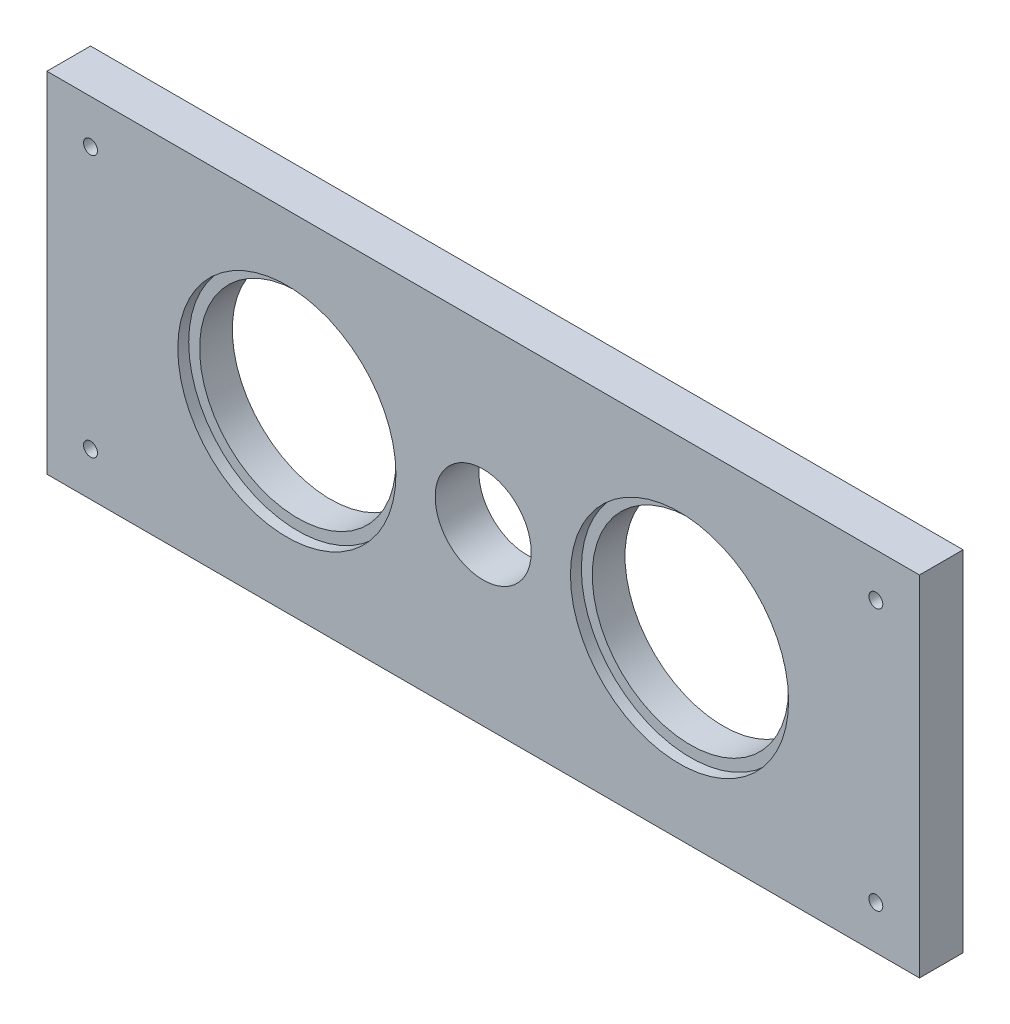
ISO-10303-21;
HEADER;
FILE_DESCRIPTION(('STEP AP214'),'2;1');
FILE_NAME('part.step','',(''),(''),'','','');
FILE_SCHEMA(('AUTOMOTIVE_DESIGN { 1 0 10303 214 1 1 1 1 }'));
ENDSEC;
DATA;
#1=APPLICATION_CONTEXT('core data for automotive mechanical design processes');
#2=APPLICATION_PROTOCOL_DEFINITION('international standard','automotive_design',2000,#1);
#3=PRODUCT_CONTEXT('',#1,'mechanical');
#4=PRODUCT('Part','Part','',(#3));
#5=PRODUCT_RELATED_PRODUCT_CATEGORY('part','',(#4));
#6=PRODUCT_DEFINITION_FORMATION('','',#4);
#7=PRODUCT_DEFINITION_CONTEXT('part definition',#1,'design');
#8=PRODUCT_DEFINITION('design','',#6,#7);
#9=PRODUCT_DEFINITION_SHAPE('','',#8);
#10=(LENGTH_UNIT() NAMED_UNIT(*) SI_UNIT(.MILLI.,.METRE.));
#11=(NAMED_UNIT(*) PLANE_ANGLE_UNIT() SI_UNIT($,.RADIAN.));
#12=(NAMED_UNIT(*) SI_UNIT($,.STERADIAN.) SOLID_ANGLE_UNIT());
#13=UNCERTAINTY_MEASURE_WITH_UNIT(LENGTH_MEASURE(1.E-05),#10,'distance_accuracy_value','');
#14=(GEOMETRIC_REPRESENTATION_CONTEXT(3) GLOBAL_UNCERTAINTY_ASSIGNED_CONTEXT((#13)) GLOBAL_UNIT_ASSIGNED_CONTEXT((#10,
#11,#12)) REPRESENTATION_CONTEXT('',''));
#15=CARTESIAN_POINT('',(0.,0.,0.));
#16=DIRECTION('',(0.,0.,1.));
#17=DIRECTION('',(1.,0.,0.));
#18=AXIS2_PLACEMENT_3D('',#15,#16,#17);
#19=CARTESIAN_POINT('',(57.15,0.,-12.7));
#20=DIRECTION('',(0.,0.,1.));
#21=DIRECTION('',(1.,0.,0.));
#22=AXIS2_PLACEMENT_3D('',#19,#20,#21);
#23=CYLINDRICAL_SURFACE('',#22,28.575);
#24=CARTESIAN_POINT('',(57.15,0.,-12.7));
#25=DIRECTION('',(0.,0.,1.));
#26=DIRECTION('',(1.,0.,0.));
#27=AXIS2_PLACEMENT_3D('',#24,#25,#26);
#28=CIRCLE('',#27,28.575);
#29=CARTESIAN_POINT('',(85.725,0.,-12.7));
#30=VERTEX_POINT('',#29);
#31=EDGE_CURVE('E95',#30,#30,#28,.T.);
#32=ORIENTED_EDGE('',*,*,#31,.F.);
#33=EDGE_LOOP('',(#32));
#34=FACE_BOUND('',#33,.T.);
#35=CARTESIAN_POINT('',(57.15,0.,-3.175));
#36=DIRECTION('',(0.,0.,1.));
#37=DIRECTION('',(1.,0.,0.));
#38=AXIS2_PLACEMENT_3D('',#35,#36,#37);
#39=CIRCLE('',#38,28.575);
#40=CARTESIAN_POINT('',(85.725,0.,-3.175));
#41=VERTEX_POINT('',#40);
#42=EDGE_CURVE('E35',#41,#41,#39,.F.);
#43=ORIENTED_EDGE('',*,*,#42,.F.);
#44=EDGE_LOOP('',(#43));
#45=FACE_BOUND('',#44,.T.);
#46=ADVANCED_FACE('F31',(#34,#45),#23,.F.);
#47=CARTESIAN_POINT('',(-57.15,0.,-12.7));
#48=DIRECTION('',(0.,0.,1.));
#49=DIRECTION('',(1.,0.,0.));
#50=AXIS2_PLACEMENT_3D('',#47,#48,#49);
#51=CYLINDRICAL_SURFACE('',#50,28.575);
#52=CARTESIAN_POINT('',(-57.15,0.,-12.7));
#53=DIRECTION('',(0.,0.,1.));
#54=DIRECTION('',(1.,0.,0.));
#55=AXIS2_PLACEMENT_3D('',#52,#53,#54);
#56=CIRCLE('',#55,28.575);
#57=CARTESIAN_POINT('',(-28.575,0.,-12.7));
#58=VERTEX_POINT('',#57);
#59=EDGE_CURVE('E92',#58,#58,#56,.T.);
#60=ORIENTED_EDGE('',*,*,#59,.F.);
#61=EDGE_LOOP('',(#60));
#62=FACE_BOUND('',#61,.T.);
#63=CARTESIAN_POINT('',(-57.15,0.,-3.175));
#64=DIRECTION('',(0.,0.,1.));
#65=DIRECTION('',(1.,0.,0.));
#66=AXIS2_PLACEMENT_3D('',#63,#64,#65);
#67=CIRCLE('',#66,28.575);
#68=CARTESIAN_POINT('',(-28.575,0.,-3.175));
#69=VERTEX_POINT('',#68);
#70=EDGE_CURVE('E108',#69,#69,#67,.F.);
#71=ORIENTED_EDGE('',*,*,#70,.F.);
#72=EDGE_LOOP('',(#71));
#73=FACE_BOUND('',#72,.T.);
#74=ADVANCED_FACE('F135',(#62,#73),#51,.F.);
#75=CARTESIAN_POINT('',(-127.,50.8,-12.7));
#76=DIRECTION('',(-1.,0.,0.));
#77=DIRECTION('',(0.,0.,1.));
#78=AXIS2_PLACEMENT_3D('',#75,#76,#77);
#79=PLANE('',#78);
#80=DIRECTION('',(0.,-1.,0.));
#81=VECTOR('',#80,1.);
#82=CARTESIAN_POINT('',(-127.,50.8,0.));
#83=LINE('',#82,#81);
#84=CARTESIAN_POINT('',(-127.,50.8,0.));
#85=VERTEX_POINT('',#84);
#86=CARTESIAN_POINT('',(-127.,-50.8,0.));
#87=VERTEX_POINT('',#86);
#88=EDGE_CURVE('E73',#85,#87,#83,.T.);
#89=ORIENTED_EDGE('',*,*,#88,.F.);
#90=DIRECTION('',(0.,0.,1.));
#91=VECTOR('',#90,1.);
#92=CARTESIAN_POINT('',(-127.,50.8,-12.7));
#93=LINE('',#92,#91);
#94=CARTESIAN_POINT('',(-127.,50.8,-12.7));
#95=VERTEX_POINT('',#94);
#96=EDGE_CURVE('E11',#95,#85,#93,.T.);
#97=ORIENTED_EDGE('',*,*,#96,.F.);
#98=DIRECTION('',(0.,-1.,0.));
#99=VECTOR('',#98,1.);
#100=CARTESIAN_POINT('',(-127.,50.8,-12.7));
#101=LINE('',#100,#99);
#102=CARTESIAN_POINT('',(-127.,-50.8,-12.7));
#103=VERTEX_POINT('',#102);
#104=EDGE_CURVE('E75',#95,#103,#101,.T.);
#105=ORIENTED_EDGE('',*,*,#104,.T.);
#106=DIRECTION('',(0.,0.,1.));
#107=VECTOR('',#106,1.);
#108=CARTESIAN_POINT('',(-127.,-50.8,-12.7));
#109=LINE('',#108,#107);
#110=EDGE_CURVE('E70',#103,#87,#109,.T.);
#111=ORIENTED_EDGE('',*,*,#110,.T.);
#112=EDGE_LOOP('',(#89,#97,#105,#111));
#113=FACE_BOUND('',#112,.T.);
#114=ADVANCED_FACE('F33',(#113),#79,.T.);
#115=CARTESIAN_POINT('',(-127.,50.8,-12.7));
#116=DIRECTION('',(0.,1.,0.));
#117=DIRECTION('',(0.,0.,1.));
#118=AXIS2_PLACEMENT_3D('',#115,#116,#117);
#119=PLANE('',#118);
#120=DIRECTION('',(-1.,0.,0.));
#121=VECTOR('',#120,1.);
#122=CARTESIAN_POINT('',(-127.,50.8,0.));
#123=LINE('',#122,#121);
#124=CARTESIAN_POINT('',(127.,50.8,0.));
#125=VERTEX_POINT('',#124);
#126=EDGE_CURVE('E91',#125,#85,#123,.T.);
#127=ORIENTED_EDGE('',*,*,#126,.F.);
#128=DIRECTION('',(0.,0.,1.));
#129=VECTOR('',#128,1.);
#130=CARTESIAN_POINT('',(127.,50.8,-12.7));
#131=LINE('',#130,#129);
#132=CARTESIAN_POINT('',(127.,50.8,-12.7));
#133=VERTEX_POINT('',#132);
#134=EDGE_CURVE('E40',#133,#125,#131,.T.);
#135=ORIENTED_EDGE('',*,*,#134,.F.);
#136=DIRECTION('',(-1.,0.,0.));
#137=VECTOR('',#136,1.);
#138=CARTESIAN_POINT('',(-127.,50.8,-12.7));
#139=LINE('',#138,#137);
#140=EDGE_CURVE('E80',#133,#95,#139,.T.);
#141=ORIENTED_EDGE('',*,*,#140,.T.);
#142=ORIENTED_EDGE('',*,*,#96,.T.);
#143=EDGE_LOOP('',(#127,#135,#141,#142));
#144=FACE_BOUND('',#143,.T.);
#145=ADVANCED_FACE('F210',(#144),#119,.T.);
#146=CARTESIAN_POINT('',(127.,50.8,-12.7));
#147=DIRECTION('',(1.,0.,0.));
#148=DIRECTION('',(0.,0.,-1.));
#149=AXIS2_PLACEMENT_3D('',#146,#147,#148);
#150=PLANE('',#149);
#151=DIRECTION('',(0.,1.,0.));
#152=VECTOR('',#151,1.);
#153=CARTESIAN_POINT('',(127.,50.8,0.));
#154=LINE('',#153,#152);
#155=CARTESIAN_POINT('',(127.,-50.8,0.));
#156=VERTEX_POINT('',#155);
#157=EDGE_CURVE('E88',#156,#125,#154,.T.);
#158=ORIENTED_EDGE('',*,*,#157,.F.);
#159=DIRECTION('',(0.,0.,1.));
#160=VECTOR('',#159,1.);
#161=CARTESIAN_POINT('',(127.,-50.8,-12.7));
#162=LINE('',#161,#160);
#163=CARTESIAN_POINT('',(127.,-50.8,-12.7));
#164=VERTEX_POINT('',#163);
#165=EDGE_CURVE('E79',#164,#156,#162,.T.);
#166=ORIENTED_EDGE('',*,*,#165,.F.);
#167=DIRECTION('',(0.,1.,0.));
#168=VECTOR('',#167,1.);
#169=CARTESIAN_POINT('',(127.,50.8,-12.7));
#170=LINE('',#169,#168);
#171=EDGE_CURVE('E104',#164,#133,#170,.T.);
#172=ORIENTED_EDGE('',*,*,#171,.T.);
#173=ORIENTED_EDGE('',*,*,#134,.T.);
#174=EDGE_LOOP('',(#158,#166,#172,#173));
#175=FACE_BOUND('',#174,.T.);
#176=ADVANCED_FACE('F213',(#175),#150,.T.);
#177=CARTESIAN_POINT('',(-127.,-50.8,-12.7));
#178=DIRECTION('',(0.,-1.,0.));
#179=DIRECTION('',(0.,0.,-1.));
#180=AXIS2_PLACEMENT_3D('',#177,#178,#179);
#181=PLANE('',#180);
#182=DIRECTION('',(1.,0.,0.));
#183=VECTOR('',#182,1.);
#184=CARTESIAN_POINT('',(-127.,-50.8,0.));
#185=LINE('',#184,#183);
#186=EDGE_CURVE('E83',#87,#156,#185,.T.);
#187=ORIENTED_EDGE('',*,*,#186,.F.);
#188=ORIENTED_EDGE('',*,*,#110,.F.);
#189=DIRECTION('',(1.,0.,0.));
#190=VECTOR('',#189,1.);
#191=CARTESIAN_POINT('',(-127.,-50.8,-12.7));
#192=LINE('',#191,#190);
#193=EDGE_CURVE('E102',#103,#164,#192,.T.);
#194=ORIENTED_EDGE('',*,*,#193,.T.);
#195=ORIENTED_EDGE('',*,*,#165,.T.);
#196=EDGE_LOOP('',(#187,#188,#194,#195));
#197=FACE_BOUND('',#196,.T.);
#198=ADVANCED_FACE('F84',(#197),#181,.T.);
#199=CARTESIAN_POINT('',(-127.,-50.8,-12.7));
#200=DIRECTION('',(0.,0.,1.));
#201=DIRECTION('',(1.,0.,0.));
#202=AXIS2_PLACEMENT_3D('',#199,#200,#201);
#203=PLANE('',#202);
#204=CARTESIAN_POINT('',(114.3,38.1,-12.7));
#205=DIRECTION('',(0.,0.,1.));
#206=DIRECTION('',(1.,0.,0.));
#207=AXIS2_PLACEMENT_3D('',#204,#205,#206);
#208=CIRCLE('',#207,2.01930000000001);
#209=CARTESIAN_POINT('',(116.3193,38.1,-12.7));
#210=VERTEX_POINT('',#209);
#211=EDGE_CURVE('E166',#210,#210,#208,.T.);
#212=ORIENTED_EDGE('',*,*,#211,.T.);
#213=EDGE_LOOP('',(#212));
#214=FACE_BOUND('',#213,.T.);
#215=CARTESIAN_POINT('',(114.3,-38.1,-12.7));
#216=DIRECTION('',(0.,0.,1.));
#217=DIRECTION('',(1.,0.,0.));
#218=AXIS2_PLACEMENT_3D('',#215,#216,#217);
#219=CIRCLE('',#218,2.01930000000001);
#220=CARTESIAN_POINT('',(116.3193,-38.1,-12.7));
#221=VERTEX_POINT('',#220);
#222=EDGE_CURVE('E160',#221,#221,#219,.T.);
#223=ORIENTED_EDGE('',*,*,#222,.T.);
#224=EDGE_LOOP('',(#223));
#225=FACE_BOUND('',#224,.T.);
#226=CARTESIAN_POINT('',(-114.3,38.1,-12.7));
#227=DIRECTION('',(0.,0.,1.));
#228=DIRECTION('',(1.,0.,0.));
#229=AXIS2_PLACEMENT_3D('',#226,#227,#228);
#230=CIRCLE('',#229,2.01930000000001);
#231=CARTESIAN_POINT('',(-112.2807,38.1,-12.7));
#232=VERTEX_POINT('',#231);
#233=EDGE_CURVE('E154',#232,#232,#230,.T.);
#234=ORIENTED_EDGE('',*,*,#233,.T.);
#235=EDGE_LOOP('',(#234));
#236=FACE_BOUND('',#235,.T.);
#237=CARTESIAN_POINT('',(-114.3,-38.0999999999999,-12.7));
#238=DIRECTION('',(0.,0.,1.));
#239=DIRECTION('',(1.,0.,0.));
#240=AXIS2_PLACEMENT_3D('',#237,#238,#239);
#241=CIRCLE('',#240,2.01930000000001);
#242=CARTESIAN_POINT('',(-112.2807,-38.0999999999999,-12.7));
#243=VERTEX_POINT('',#242);
#244=EDGE_CURVE('E146',#243,#243,#241,.T.);
#245=ORIENTED_EDGE('',*,*,#244,.T.);
#246=EDGE_LOOP('',(#245));
#247=FACE_BOUND('',#246,.T.);
#248=CARTESIAN_POINT('',(0.,0.,-12.7));
#249=DIRECTION('',(0.,0.,1.));
#250=DIRECTION('',(1.,0.,0.));
#251=AXIS2_PLACEMENT_3D('',#248,#249,#250);
#252=CIRCLE('',#251,13.9773153160108);
#253=CARTESIAN_POINT('',(13.9773153160108,0.,-12.7));
#254=VERTEX_POINT('',#253);
#255=EDGE_CURVE('E115',#254,#254,#252,.T.);
#256=ORIENTED_EDGE('',*,*,#255,.T.);
#257=EDGE_LOOP('',(#256));
#258=FACE_BOUND('',#257,.T.);
#259=ORIENTED_EDGE('',*,*,#31,.T.);
#260=EDGE_LOOP('',(#259));
#261=FACE_BOUND('',#260,.T.);
#262=ORIENTED_EDGE('',*,*,#59,.T.);
#263=EDGE_LOOP('',(#262));
#264=FACE_BOUND('',#263,.T.);
#265=ORIENTED_EDGE('',*,*,#104,.F.);
#266=ORIENTED_EDGE('',*,*,#140,.F.);
#267=ORIENTED_EDGE('',*,*,#171,.F.);
#268=ORIENTED_EDGE('',*,*,#193,.F.);
#269=EDGE_LOOP('',(#265,#266,#267,#268));
#270=FACE_BOUND('',#269,.T.);
#271=ADVANCED_FACE('F130',(#214,#225,#236,#247,#258,#261,#264,#270),#203,.F.);
#272=CARTESIAN_POINT('',(-127.,-50.8,0.));
#273=DIRECTION('',(0.,0.,1.));
#274=DIRECTION('',(1.,0.,0.));
#275=AXIS2_PLACEMENT_3D('',#272,#273,#274);
#276=PLANE('',#275);
#277=CARTESIAN_POINT('',(114.3,38.1,0.));
#278=DIRECTION('',(0.,0.,1.));
#279=DIRECTION('',(1.,0.,0.));
#280=AXIS2_PLACEMENT_3D('',#277,#278,#279);
#281=CIRCLE('',#280,2.01930000000001);
#282=CARTESIAN_POINT('',(116.3193,38.1,0.));
#283=VERTEX_POINT('',#282);
#284=EDGE_CURVE('E169',#283,#283,#281,.T.);
#285=ORIENTED_EDGE('',*,*,#284,.F.);
#286=EDGE_LOOP('',(#285));
#287=FACE_BOUND('',#286,.T.);
#288=CARTESIAN_POINT('',(114.3,-38.1,0.));
#289=DIRECTION('',(0.,0.,1.));
#290=DIRECTION('',(1.,0.,0.));
#291=AXIS2_PLACEMENT_3D('',#288,#289,#290);
#292=CIRCLE('',#291,2.01930000000001);
#293=CARTESIAN_POINT('',(116.3193,-38.1,0.));
#294=VERTEX_POINT('',#293);
#295=EDGE_CURVE('E163',#294,#294,#292,.T.);
#296=ORIENTED_EDGE('',*,*,#295,.F.);
#297=EDGE_LOOP('',(#296));
#298=FACE_BOUND('',#297,.T.);
#299=CARTESIAN_POINT('',(-114.3,38.1,0.));
#300=DIRECTION('',(0.,0.,1.));
#301=DIRECTION('',(1.,0.,0.));
#302=AXIS2_PLACEMENT_3D('',#299,#300,#301);
#303=CIRCLE('',#302,2.01930000000001);
#304=CARTESIAN_POINT('',(-112.2807,38.1,0.));
#305=VERTEX_POINT('',#304);
#306=EDGE_CURVE('E157',#305,#305,#303,.T.);
#307=ORIENTED_EDGE('',*,*,#306,.F.);
#308=EDGE_LOOP('',(#307));
#309=FACE_BOUND('',#308,.T.);
#310=CARTESIAN_POINT('',(-114.3,-38.0999999999999,0.));
#311=DIRECTION('',(0.,0.,1.));
#312=DIRECTION('',(1.,0.,0.));
#313=AXIS2_PLACEMENT_3D('',#310,#311,#312);
#314=CIRCLE('',#313,2.01930000000001);
#315=CARTESIAN_POINT('',(-112.2807,-38.0999999999999,0.));
#316=VERTEX_POINT('',#315);
#317=EDGE_CURVE('E151',#316,#316,#314,.T.);
#318=ORIENTED_EDGE('',*,*,#317,.F.);
#319=EDGE_LOOP('',(#318));
#320=FACE_BOUND('',#319,.T.);
#321=CARTESIAN_POINT('',(57.15,0.,0.));
#322=DIRECTION('',(0.,0.,1.));
#323=DIRECTION('',(1.,0.,0.));
#324=AXIS2_PLACEMENT_3D('',#321,#322,#323);
#325=CIRCLE('',#324,31.75);
#326=CARTESIAN_POINT('',(88.9,0.,0.));
#327=VERTEX_POINT('',#326);
#328=EDGE_CURVE('E142',#327,#327,#325,.T.);
#329=ORIENTED_EDGE('',*,*,#328,.F.);
#330=EDGE_LOOP('',(#329));
#331=FACE_BOUND('',#330,.T.);
#332=CARTESIAN_POINT('',(-57.15,0.,0.));
#333=DIRECTION('',(0.,0.,1.));
#334=DIRECTION('',(1.,0.,0.));
#335=AXIS2_PLACEMENT_3D('',#332,#333,#334);
#336=CIRCLE('',#335,31.75);
#337=CARTESIAN_POINT('',(-25.4,0.,0.));
#338=VERTEX_POINT('',#337);
#339=EDGE_CURVE('E118',#338,#338,#336,.T.);
#340=ORIENTED_EDGE('',*,*,#339,.F.);
#341=EDGE_LOOP('',(#340));
#342=FACE_BOUND('',#341,.T.);
#343=CARTESIAN_POINT('',(0.,0.,0.));
#344=DIRECTION('',(0.,0.,1.));
#345=DIRECTION('',(1.,0.,0.));
#346=AXIS2_PLACEMENT_3D('',#343,#344,#345);
#347=CIRCLE('',#346,13.9773153160108);
#348=CARTESIAN_POINT('',(13.9773153160108,0.,0.));
#349=VERTEX_POINT('',#348);
#350=EDGE_CURVE('E110',#349,#349,#347,.T.);
#351=ORIENTED_EDGE('',*,*,#350,.F.);
#352=EDGE_LOOP('',(#351));
#353=FACE_BOUND('',#352,.T.);
#354=ORIENTED_EDGE('',*,*,#88,.T.);
#355=ORIENTED_EDGE('',*,*,#186,.T.);
#356=ORIENTED_EDGE('',*,*,#157,.T.);
#357=ORIENTED_EDGE('',*,*,#126,.T.);
#358=EDGE_LOOP('',(#354,#355,#356,#357));
#359=FACE_BOUND('',#358,.T.);
#360=ADVANCED_FACE('F90',(#287,#298,#309,#320,#331,#342,#353,#359),#276,.T.);
#361=CARTESIAN_POINT('',(0.,0.,-12.7));
#362=DIRECTION('',(0.,0.,1.));
#363=DIRECTION('',(1.,0.,0.));
#364=AXIS2_PLACEMENT_3D('',#361,#362,#363);
#365=CYLINDRICAL_SURFACE('',#364,13.9773153160108);
#366=ORIENTED_EDGE('',*,*,#255,.F.);
#367=EDGE_LOOP('',(#366));
#368=FACE_BOUND('',#367,.T.);
#369=ORIENTED_EDGE('',*,*,#350,.T.);
#370=EDGE_LOOP('',(#369));
#371=FACE_BOUND('',#370,.T.);
#372=ADVANCED_FACE('F178',(#368,#371),#365,.F.);
#373=CARTESIAN_POINT('',(-57.15,0.,-3.175));
#374=DIRECTION('',(0.,0.,1.));
#375=DIRECTION('',(1.,0.,0.));
#376=AXIS2_PLACEMENT_3D('',#373,#374,#375);
#377=PLANE('',#376);
#378=CARTESIAN_POINT('',(-57.15,0.,-3.175));
#379=DIRECTION('',(0.,0.,1.));
#380=DIRECTION('',(1.,0.,0.));
#381=AXIS2_PLACEMENT_3D('',#378,#379,#380);
#382=CIRCLE('',#381,31.75);
#383=CARTESIAN_POINT('',(-25.4,0.,-3.175));
#384=VERTEX_POINT('',#383);
#385=EDGE_CURVE('E111',#384,#384,#382,.T.);
#386=ORIENTED_EDGE('',*,*,#385,.T.);
#387=EDGE_LOOP('',(#386));
#388=FACE_BOUND('',#387,.T.);
#389=ORIENTED_EDGE('',*,*,#70,.T.);
#390=EDGE_LOOP('',(#389));
#391=FACE_BOUND('',#390,.T.);
#392=ADVANCED_FACE('F193',(#388,#391),#377,.T.);
#393=CARTESIAN_POINT('',(-57.15,0.,-3.175));
#394=DIRECTION('',(0.,0.,1.));
#395=DIRECTION('',(1.,0.,0.));
#396=AXIS2_PLACEMENT_3D('',#393,#394,#395);
#397=CYLINDRICAL_SURFACE('',#396,31.75);
#398=ORIENTED_EDGE('',*,*,#385,.F.);
#399=EDGE_LOOP('',(#398));
#400=FACE_BOUND('',#399,.T.);
#401=ORIENTED_EDGE('',*,*,#339,.T.);
#402=EDGE_LOOP('',(#401));
#403=FACE_BOUND('',#402,.T.);
#404=ADVANCED_FACE('F199',(#400,#403),#397,.F.);
#405=CARTESIAN_POINT('',(57.15,0.,-3.175));
#406=DIRECTION('',(0.,0.,1.));
#407=DIRECTION('',(1.,0.,0.));
#408=AXIS2_PLACEMENT_3D('',#405,#406,#407);
#409=PLANE('',#408);
#410=CARTESIAN_POINT('',(57.15,0.,-3.175));
#411=DIRECTION('',(0.,0.,1.));
#412=DIRECTION('',(1.,0.,0.));
#413=AXIS2_PLACEMENT_3D('',#410,#411,#412);
#414=CIRCLE('',#413,31.75);
#415=CARTESIAN_POINT('',(88.9,0.,-3.175));
#416=VERTEX_POINT('',#415);
#417=EDGE_CURVE('E140',#416,#416,#414,.T.);
#418=ORIENTED_EDGE('',*,*,#417,.T.);
#419=EDGE_LOOP('',(#418));
#420=FACE_BOUND('',#419,.T.);
#421=ORIENTED_EDGE('',*,*,#42,.T.);
#422=EDGE_LOOP('',(#421));
#423=FACE_BOUND('',#422,.T.);
#424=ADVANCED_FACE('F250',(#420,#423),#409,.T.);
#425=CARTESIAN_POINT('',(57.15,0.,-3.175));
#426=DIRECTION('',(0.,0.,1.));
#427=DIRECTION('',(1.,0.,0.));
#428=AXIS2_PLACEMENT_3D('',#425,#426,#427);
#429=CYLINDRICAL_SURFACE('',#428,31.75);
#430=ORIENTED_EDGE('',*,*,#417,.F.);
#431=EDGE_LOOP('',(#430));
#432=FACE_BOUND('',#431,.T.);
#433=ORIENTED_EDGE('',*,*,#328,.T.);
#434=EDGE_LOOP('',(#433));
#435=FACE_BOUND('',#434,.T.);
#436=ADVANCED_FACE('F259',(#432,#435),#429,.F.);
#437=CARTESIAN_POINT('',(-114.3,-38.0999999999999,-25.4));
#438=DIRECTION('',(0.,0.,1.));
#439=DIRECTION('',(1.,0.,0.));
#440=AXIS2_PLACEMENT_3D('',#437,#438,#439);
#441=CYLINDRICAL_SURFACE('',#440,2.01930000000001);
#442=ORIENTED_EDGE('',*,*,#317,.T.);
#443=EDGE_LOOP('',(#442));
#444=FACE_BOUND('',#443,.T.);
#445=ORIENTED_EDGE('',*,*,#244,.F.);
#446=EDGE_LOOP('',(#445));
#447=FACE_BOUND('',#446,.T.);
#448=ADVANCED_FACE('F268',(#444,#447),#441,.F.);
#449=CARTESIAN_POINT('',(-114.3,38.1,-25.4));
#450=DIRECTION('',(0.,0.,1.));
#451=DIRECTION('',(1.,0.,0.));
#452=AXIS2_PLACEMENT_3D('',#449,#450,#451);
#453=CYLINDRICAL_SURFACE('',#452,2.01930000000001);
#454=ORIENTED_EDGE('',*,*,#306,.T.);
#455=EDGE_LOOP('',(#454));
#456=FACE_BOUND('',#455,.T.);
#457=ORIENTED_EDGE('',*,*,#233,.F.);
#458=EDGE_LOOP('',(#457));
#459=FACE_BOUND('',#458,.T.);
#460=ADVANCED_FACE('F278',(#456,#459),#453,.F.);
#461=CARTESIAN_POINT('',(114.3,-38.1,-25.4));
#462=DIRECTION('',(0.,0.,1.));
#463=DIRECTION('',(1.,0.,0.));
#464=AXIS2_PLACEMENT_3D('',#461,#462,#463);
#465=CYLINDRICAL_SURFACE('',#464,2.01930000000001);
#466=ORIENTED_EDGE('',*,*,#295,.T.);
#467=EDGE_LOOP('',(#466));
#468=FACE_BOUND('',#467,.T.);
#469=ORIENTED_EDGE('',*,*,#222,.F.);
#470=EDGE_LOOP('',(#469));
#471=FACE_BOUND('',#470,.T.);
#472=ADVANCED_FACE('F288',(#468,#471),#465,.F.);
#473=CARTESIAN_POINT('',(114.3,38.1,-25.4));
#474=DIRECTION('',(0.,0.,1.));
#475=DIRECTION('',(1.,0.,0.));
#476=AXIS2_PLACEMENT_3D('',#473,#474,#475);
#477=CYLINDRICAL_SURFACE('',#476,2.01930000000001);
#478=ORIENTED_EDGE('',*,*,#284,.T.);
#479=EDGE_LOOP('',(#478));
#480=FACE_BOUND('',#479,.T.);
#481=ORIENTED_EDGE('',*,*,#211,.F.);
#482=EDGE_LOOP('',(#481));
#483=FACE_BOUND('',#482,.T.);
#484=ADVANCED_FACE('F173',(#480,#483),#477,.F.);
#485=CLOSED_SHELL('',(#46,#74,#114,#145,#176,#198,#271,#360,#372,#392,#404,#424,#436,#448,#460,
#472,#484));
#486=MANIFOLD_SOLID_BREP('B2',#485);
#487=ADVANCED_BREP_SHAPE_REPRESENTATION('',(#18,#486),#14);
#488=SHAPE_DEFINITION_REPRESENTATION(#9,#487);
ENDSEC;
END-ISO-10303-21;
